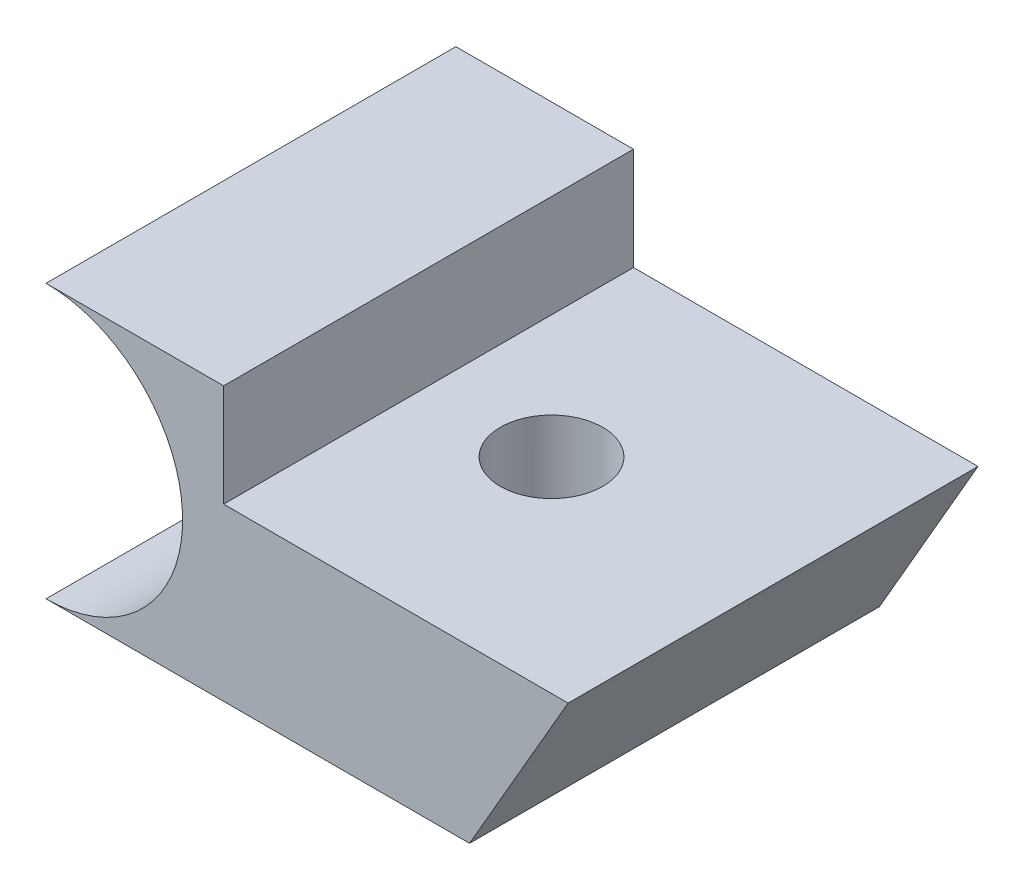
ISO-10303-21;
HEADER;
FILE_DESCRIPTION(('STEP AP214'),'2;1');
FILE_NAME('part.step','',(''),(''),'','','');
FILE_SCHEMA(('AUTOMOTIVE_DESIGN { 1 0 10303 214 1 1 1 1 }'));
ENDSEC;
DATA;
#1=APPLICATION_CONTEXT('core data for automotive mechanical design processes');
#2=APPLICATION_PROTOCOL_DEFINITION('international standard','automotive_design',2000,#1);
#3=PRODUCT_CONTEXT('',#1,'mechanical');
#4=PRODUCT('Part','Part','',(#3));
#5=PRODUCT_RELATED_PRODUCT_CATEGORY('part','',(#4));
#6=PRODUCT_DEFINITION_FORMATION('','',#4);
#7=PRODUCT_DEFINITION_CONTEXT('part definition',#1,'design');
#8=PRODUCT_DEFINITION('design','',#6,#7);
#9=PRODUCT_DEFINITION_SHAPE('','',#8);
#10=(LENGTH_UNIT() NAMED_UNIT(*) SI_UNIT(.MILLI.,.METRE.));
#11=(NAMED_UNIT(*) PLANE_ANGLE_UNIT() SI_UNIT($,.RADIAN.));
#12=(NAMED_UNIT(*) SI_UNIT($,.STERADIAN.) SOLID_ANGLE_UNIT());
#13=UNCERTAINTY_MEASURE_WITH_UNIT(LENGTH_MEASURE(1.E-05),#10,'distance_accuracy_value','');
#14=(GEOMETRIC_REPRESENTATION_CONTEXT(3) GLOBAL_UNCERTAINTY_ASSIGNED_CONTEXT((#13)) GLOBAL_UNIT_ASSIGNED_CONTEXT((#10,
#11,#12)) REPRESENTATION_CONTEXT('',''));
#15=CARTESIAN_POINT('',(0.,0.,0.));
#16=DIRECTION('',(0.,0.,1.));
#17=DIRECTION('',(1.,0.,0.));
#18=AXIS2_PLACEMENT_3D('',#15,#16,#17);
#19=CARTESIAN_POINT('',(0.,12.7,38.1));
#20=DIRECTION('',(0.,0.,-1.));
#21=DIRECTION('',(-1.,0.,0.));
#22=AXIS2_PLACEMENT_3D('',#19,#20,#21);
#23=CYLINDRICAL_SURFACE('',#22,12.7);
#24=CARTESIAN_POINT('',(0.,12.7,0.));
#25=DIRECTION('',(0.,0.,-1.));
#26=DIRECTION('',(1.,0.,0.));
#27=AXIS2_PLACEMENT_3D('',#24,#25,#26);
#28=CIRCLE('',#27,12.7);
#29=CARTESIAN_POINT('',(0.,25.4,0.));
#30=VERTEX_POINT('',#29);
#31=CARTESIAN_POINT('',(0.,0.,0.));
#32=VERTEX_POINT('',#31);
#33=EDGE_CURVE('E116',#30,#32,#28,.T.);
#34=ORIENTED_EDGE('',*,*,#33,.T.);
#35=DIRECTION('',(0.,0.,-1.));
#36=VECTOR('',#35,1.);
#37=CARTESIAN_POINT('',(0.,0.,38.1));
#38=LINE('',#37,#36);
#39=CARTESIAN_POINT('',(0.,0.,38.1));
#40=VERTEX_POINT('',#39);
#41=EDGE_CURVE('E100',#40,#32,#38,.T.);
#42=ORIENTED_EDGE('',*,*,#41,.F.);
#43=CARTESIAN_POINT('',(0.,12.7,38.1));
#44=DIRECTION('',(0.,0.,-1.));
#45=DIRECTION('',(1.,0.,0.));
#46=AXIS2_PLACEMENT_3D('',#43,#44,#45);
#47=CIRCLE('',#46,12.7);
#48=CARTESIAN_POINT('',(0.,25.4,38.1));
#49=VERTEX_POINT('',#48);
#50=EDGE_CURVE('E104',#49,#40,#47,.T.);
#51=ORIENTED_EDGE('',*,*,#50,.F.);
#52=DIRECTION('',(0.,0.,-1.));
#53=VECTOR('',#52,1.);
#54=CARTESIAN_POINT('',(0.,25.4,38.1));
#55=LINE('',#54,#53);
#56=EDGE_CURVE('E129',#49,#30,#55,.T.);
#57=ORIENTED_EDGE('',*,*,#56,.T.);
#58=EDGE_LOOP('',(#34,#42,#51,#57));
#59=FACE_BOUND('',#58,.T.);
#60=ADVANCED_FACE('F41',(#59),#23,.F.);
#61=CARTESIAN_POINT('',(0.,0.,38.1));
#62=DIRECTION('',(0.,1.,0.));
#63=DIRECTION('',(0.,0.,1.));
#64=AXIS2_PLACEMENT_3D('',#61,#62,#63);
#65=PLANE('',#64);
#66=CARTESIAN_POINT('',(27.9399979233851,0.,19.05));
#67=DIRECTION('',(0.,1.,0.));
#68=DIRECTION('',(0.,0.,1.));
#69=AXIS2_PLACEMENT_3D('',#66,#67,#68);
#70=CIRCLE('',#69,4.76249999999998);
#71=CARTESIAN_POINT('',(27.9399979233851,0.,23.8125));
#72=VERTEX_POINT('',#71);
#73=EDGE_CURVE('E143',#72,#72,#70,.T.);
#74=ORIENTED_EDGE('',*,*,#73,.T.);
#75=EDGE_LOOP('',(#74));
#76=FACE_BOUND('',#75,.T.);
#77=DIRECTION('',(1.,0.,0.));
#78=VECTOR('',#77,1.);
#79=CARTESIAN_POINT('',(0.,0.,0.));
#80=LINE('',#79,#78);
#81=CARTESIAN_POINT('',(39.3699999999998,0.,0.));
#82=VERTEX_POINT('',#81);
#83=EDGE_CURVE('E136',#32,#82,#80,.T.);
#84=ORIENTED_EDGE('',*,*,#83,.T.);
#85=DIRECTION('',(0.,0.,1.));
#86=VECTOR('',#85,1.);
#87=CARTESIAN_POINT('',(39.3699999999998,0.,38.1));
#88=LINE('',#87,#86);
#89=CARTESIAN_POINT('',(39.3699999999998,0.,38.1));
#90=VERTEX_POINT('',#89);
#91=EDGE_CURVE('E51',#82,#90,#88,.T.);
#92=ORIENTED_EDGE('',*,*,#91,.T.);
#93=DIRECTION('',(1.,0.,0.));
#94=VECTOR('',#93,1.);
#95=CARTESIAN_POINT('',(0.,0.,38.1));
#96=LINE('',#95,#94);
#97=EDGE_CURVE('E96',#40,#90,#96,.T.);
#98=ORIENTED_EDGE('',*,*,#97,.F.);
#99=ORIENTED_EDGE('',*,*,#41,.T.);
#100=EDGE_LOOP('',(#84,#92,#98,#99));
#101=FACE_BOUND('',#100,.T.);
#102=ADVANCED_FACE('F98',(#76,#101),#65,.F.);
#103=CARTESIAN_POINT('',(16.51,15.875,38.1));
#104=DIRECTION('',(0.,-1.,0.));
#105=DIRECTION('',(1.,0.,0.));
#106=AXIS2_PLACEMENT_3D('',#103,#104,#105);
#107=PLANE('',#106);
#108=CARTESIAN_POINT('',(27.9399979233851,15.875,19.05));
#109=DIRECTION('',(0.,-1.,0.));
#110=DIRECTION('',(1.,0.,0.));
#111=AXIS2_PLACEMENT_3D('',#108,#109,#110);
#112=CIRCLE('',#111,4.76249999999999);
#113=CARTESIAN_POINT('',(32.7024979233851,15.875,19.05));
#114=VERTEX_POINT('',#113);
#115=EDGE_CURVE('E46',#114,#114,#112,.T.);
#116=ORIENTED_EDGE('',*,*,#115,.T.);
#117=EDGE_LOOP('',(#116));
#118=FACE_BOUND('',#117,.T.);
#119=DIRECTION('',(-1.,0.,0.));
#120=VECTOR('',#119,1.);
#121=CARTESIAN_POINT('',(16.51,15.875,38.1));
#122=LINE('',#121,#120);
#123=CARTESIAN_POINT('',(48.5354355233851,15.875,38.1));
#124=VERTEX_POINT('',#123);
#125=CARTESIAN_POINT('',(16.51,15.875,38.1));
#126=VERTEX_POINT('',#125);
#127=EDGE_CURVE('E103',#124,#126,#122,.T.);
#128=ORIENTED_EDGE('',*,*,#127,.F.);
#129=DIRECTION('',(0.,0.,1.));
#130=VECTOR('',#129,1.);
#131=CARTESIAN_POINT('',(48.5354355233851,15.875,38.1));
#132=LINE('',#131,#130);
#133=CARTESIAN_POINT('',(48.5354355233851,15.875,0.));
#134=VERTEX_POINT('',#133);
#135=EDGE_CURVE('E117',#124,#134,#132,.F.);
#136=ORIENTED_EDGE('',*,*,#135,.T.);
#137=DIRECTION('',(-1.,0.,0.));
#138=VECTOR('',#137,1.);
#139=CARTESIAN_POINT('',(16.51,15.875,0.));
#140=LINE('',#139,#138);
#141=CARTESIAN_POINT('',(16.51,15.875,0.));
#142=VERTEX_POINT('',#141);
#143=EDGE_CURVE('E134',#134,#142,#140,.T.);
#144=ORIENTED_EDGE('',*,*,#143,.T.);
#145=DIRECTION('',(0.,0.,-1.));
#146=VECTOR('',#145,1.);
#147=CARTESIAN_POINT('',(16.51,15.875,38.1));
#148=LINE('',#147,#146);
#149=EDGE_CURVE('E118',#126,#142,#148,.T.);
#150=ORIENTED_EDGE('',*,*,#149,.F.);
#151=EDGE_LOOP('',(#128,#136,#144,#150));
#152=FACE_BOUND('',#151,.T.);
#153=ADVANCED_FACE('F150',(#118,#152),#107,.F.);
#154=CARTESIAN_POINT('',(16.51,25.4,38.1));
#155=DIRECTION('',(-1.,0.,0.));
#156=DIRECTION('',(0.,-1.,0.));
#157=AXIS2_PLACEMENT_3D('',#154,#155,#156);
#158=PLANE('',#157);
#159=DIRECTION('',(0.,1.,0.));
#160=VECTOR('',#159,1.);
#161=CARTESIAN_POINT('',(16.51,25.4,0.));
#162=LINE('',#161,#160);
#163=CARTESIAN_POINT('',(16.51,25.4,0.));
#164=VERTEX_POINT('',#163);
#165=EDGE_CURVE('E132',#142,#164,#162,.T.);
#166=ORIENTED_EDGE('',*,*,#165,.T.);
#167=DIRECTION('',(0.,0.,-1.));
#168=VECTOR('',#167,1.);
#169=CARTESIAN_POINT('',(16.51,25.4,38.1));
#170=LINE('',#169,#168);
#171=CARTESIAN_POINT('',(16.51,25.4,38.1));
#172=VERTEX_POINT('',#171);
#173=EDGE_CURVE('E122',#172,#164,#170,.T.);
#174=ORIENTED_EDGE('',*,*,#173,.F.);
#175=DIRECTION('',(0.,1.,0.));
#176=VECTOR('',#175,1.);
#177=CARTESIAN_POINT('',(16.51,25.4,38.1));
#178=LINE('',#177,#176);
#179=EDGE_CURVE('E140',#126,#172,#178,.T.);
#180=ORIENTED_EDGE('',*,*,#179,.F.);
#181=ORIENTED_EDGE('',*,*,#149,.T.);
#182=EDGE_LOOP('',(#166,#174,#180,#181));
#183=FACE_BOUND('',#182,.T.);
#184=ADVANCED_FACE('F171',(#183),#158,.F.);
#185=CARTESIAN_POINT('',(0.,25.4,38.1));
#186=DIRECTION('',(0.,-1.,0.));
#187=DIRECTION('',(1.,0.,0.));
#188=AXIS2_PLACEMENT_3D('',#185,#186,#187);
#189=PLANE('',#188);
#190=DIRECTION('',(-1.,0.,0.));
#191=VECTOR('',#190,1.);
#192=CARTESIAN_POINT('',(0.,25.4,0.));
#193=LINE('',#192,#191);
#194=EDGE_CURVE('E113',#164,#30,#193,.T.);
#195=ORIENTED_EDGE('',*,*,#194,.T.);
#196=ORIENTED_EDGE('',*,*,#56,.F.);
#197=DIRECTION('',(-1.,0.,0.));
#198=VECTOR('',#197,1.);
#199=CARTESIAN_POINT('',(0.,25.4,38.1));
#200=LINE('',#199,#198);
#201=EDGE_CURVE('E109',#172,#49,#200,.T.);
#202=ORIENTED_EDGE('',*,*,#201,.F.);
#203=ORIENTED_EDGE('',*,*,#173,.T.);
#204=EDGE_LOOP('',(#195,#196,#202,#203));
#205=FACE_BOUND('',#204,.T.);
#206=ADVANCED_FACE('F173',(#205),#189,.F.);
#207=CARTESIAN_POINT('',(0.,12.7,38.1));
#208=DIRECTION('',(0.,0.,1.));
#209=DIRECTION('',(1.,0.,0.));
#210=AXIS2_PLACEMENT_3D('',#207,#208,#209);
#211=PLANE('',#210);
#212=ORIENTED_EDGE('',*,*,#97,.T.);
#213=DIRECTION('',(-0.499999999999997,-0.86602540378444,0.));
#214=VECTOR('',#213,1.);
#215=CARTESIAN_POINT('',(35.0267613140312,-7.52271007349649,38.1));
#216=LINE('',#215,#214);
#217=EDGE_CURVE('E11',#90,#124,#216,.F.);
#218=ORIENTED_EDGE('',*,*,#217,.T.);
#219=ORIENTED_EDGE('',*,*,#127,.T.);
#220=ORIENTED_EDGE('',*,*,#179,.T.);
#221=ORIENTED_EDGE('',*,*,#201,.T.);
#222=ORIENTED_EDGE('',*,*,#50,.T.);
#223=EDGE_LOOP('',(#212,#218,#219,#220,#221,#222));
#224=FACE_BOUND('',#223,.T.);
#225=ADVANCED_FACE('F107',(#224),#211,.T.);
#226=CARTESIAN_POINT('',(0.,12.7,0.));
#227=DIRECTION('',(0.,0.,1.));
#228=DIRECTION('',(1.,0.,0.));
#229=AXIS2_PLACEMENT_3D('',#226,#227,#228);
#230=PLANE('',#229);
#231=ORIENTED_EDGE('',*,*,#143,.F.);
#232=DIRECTION('',(0.499999999999997,0.86602540378444,0.));
#233=VECTOR('',#232,1.);
#234=CARTESIAN_POINT('',(50.8,19.7973407305127,0.));
#235=LINE('',#234,#233);
#236=EDGE_CURVE('E64',#134,#82,#235,.F.);
#237=ORIENTED_EDGE('',*,*,#236,.T.);
#238=ORIENTED_EDGE('',*,*,#83,.F.);
#239=ORIENTED_EDGE('',*,*,#33,.F.);
#240=ORIENTED_EDGE('',*,*,#194,.F.);
#241=ORIENTED_EDGE('',*,*,#165,.F.);
#242=EDGE_LOOP('',(#231,#237,#238,#239,#240,#241));
#243=FACE_BOUND('',#242,.T.);
#244=ADVANCED_FACE('F161',(#243),#230,.F.);
#245=CARTESIAN_POINT('',(50.8,19.7973407305127,38.1));
#246=DIRECTION('',(-0.86602540378444,0.499999999999997,0.));
#247=DIRECTION('',(0.,0.,-1.));
#248=AXIS2_PLACEMENT_3D('',#245,#246,#247);
#249=PLANE('',#248);
#250=ORIENTED_EDGE('',*,*,#217,.F.);
#251=ORIENTED_EDGE('',*,*,#91,.F.);
#252=ORIENTED_EDGE('',*,*,#236,.F.);
#253=ORIENTED_EDGE('',*,*,#135,.F.);
#254=EDGE_LOOP('',(#250,#251,#252,#253));
#255=FACE_BOUND('',#254,.T.);
#256=ADVANCED_FACE('F44',(#255),#249,.F.);
#257=CARTESIAN_POINT('',(27.9399979233851,25.4,19.05));
#258=DIRECTION('',(0.,1.,0.));
#259=DIRECTION('',(0.,0.,1.));
#260=AXIS2_PLACEMENT_3D('',#257,#258,#259);
#261=CYLINDRICAL_SURFACE('',#260,4.76249999999999);
#262=ORIENTED_EDGE('',*,*,#73,.F.);
#263=EDGE_LOOP('',(#262));
#264=FACE_BOUND('',#263,.T.);
#265=ORIENTED_EDGE('',*,*,#115,.F.);
#266=EDGE_LOOP('',(#265));
#267=FACE_BOUND('',#266,.T.);
#268=ADVANCED_FACE('F153',(#264,#267),#261,.F.);
#269=CLOSED_SHELL('',(#60,#102,#153,#184,#206,#225,#244,#256,#268));
#270=MANIFOLD_SOLID_BREP('B2',#269);
#271=ADVANCED_BREP_SHAPE_REPRESENTATION('',(#18,#270),#14);
#272=SHAPE_DEFINITION_REPRESENTATION(#9,#271);
ENDSEC;
END-ISO-10303-21;
